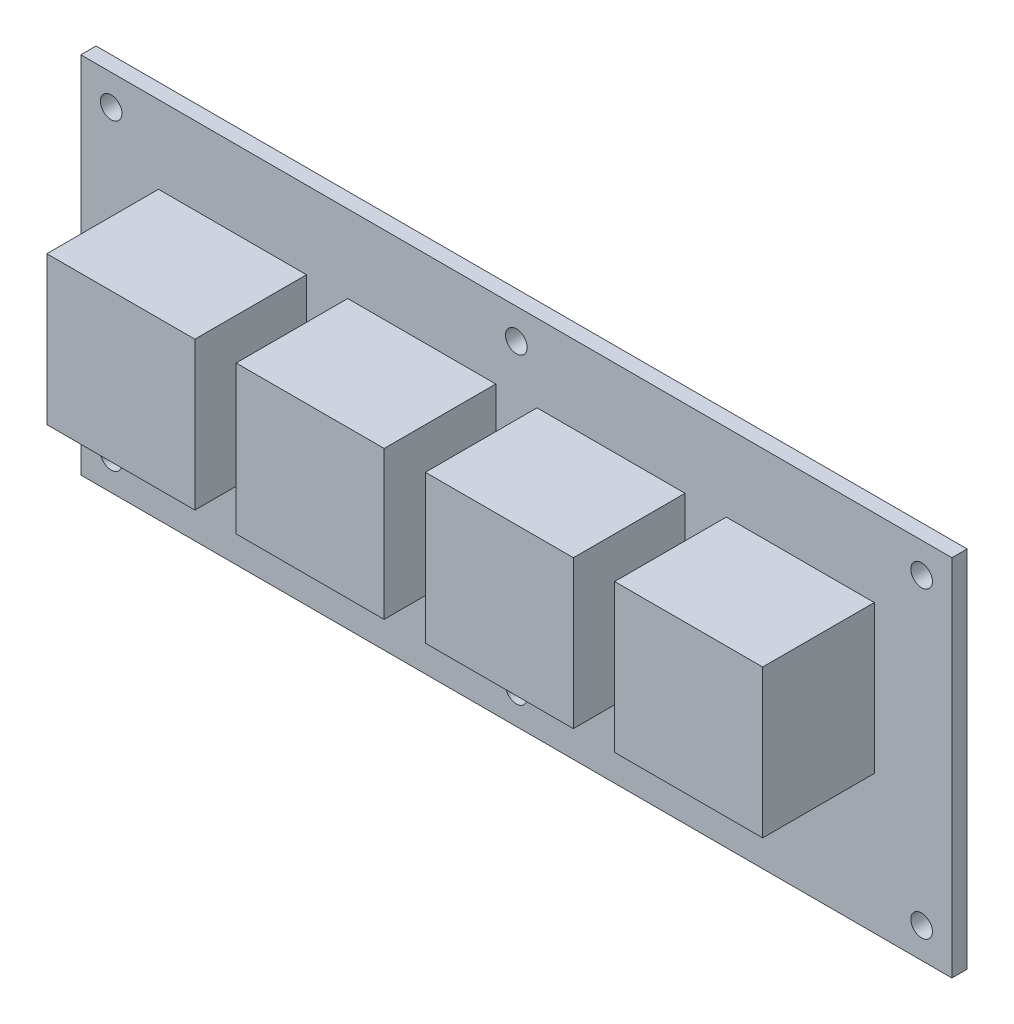
ISO-10303-21;
HEADER;
FILE_DESCRIPTION(('STEP AP214'),'2;1');
FILE_NAME('part.step','',(''),(''),'','','');
FILE_SCHEMA(('AUTOMOTIVE_DESIGN { 1 0 10303 214 1 1 1 1 }'));
ENDSEC;
DATA;
#1=APPLICATION_CONTEXT('core data for automotive mechanical design processes');
#2=APPLICATION_PROTOCOL_DEFINITION('international standard','automotive_design',2000,#1);
#3=PRODUCT_CONTEXT('',#1,'mechanical');
#4=PRODUCT('Part','Part','',(#3));
#5=PRODUCT_RELATED_PRODUCT_CATEGORY('part','',(#4));
#6=PRODUCT_DEFINITION_FORMATION('','',#4);
#7=PRODUCT_DEFINITION_CONTEXT('part definition',#1,'design');
#8=PRODUCT_DEFINITION('design','',#6,#7);
#9=PRODUCT_DEFINITION_SHAPE('','',#8);
#10=(LENGTH_UNIT() NAMED_UNIT(*) SI_UNIT(.MILLI.,.METRE.));
#11=(NAMED_UNIT(*) PLANE_ANGLE_UNIT() SI_UNIT($,.RADIAN.));
#12=(NAMED_UNIT(*) SI_UNIT($,.STERADIAN.) SOLID_ANGLE_UNIT());
#13=UNCERTAINTY_MEASURE_WITH_UNIT(LENGTH_MEASURE(1.E-05),#10,'distance_accuracy_value','');
#14=(GEOMETRIC_REPRESENTATION_CONTEXT(3) GLOBAL_UNCERTAINTY_ASSIGNED_CONTEXT((#13)) GLOBAL_UNIT_ASSIGNED_CONTEXT((#10,
#11,#12)) REPRESENTATION_CONTEXT('',''));
#15=CARTESIAN_POINT('',(0.,0.,0.));
#16=DIRECTION('',(0.,0.,1.));
#17=DIRECTION('',(1.,0.,0.));
#18=AXIS2_PLACEMENT_3D('',#15,#16,#17);
#19=CARTESIAN_POINT('',(23.622,14.478,13.276072));
#20=DIRECTION('',(0.,1.,0.));
#21=DIRECTION('',(0.,0.,1.));
#22=AXIS2_PLACEMENT_3D('',#19,#20,#21);
#23=PLANE('',#22);
#24=DIRECTION('',(1.,0.,0.));
#25=VECTOR('',#24,1.);
#26=CARTESIAN_POINT('',(23.622,14.478,1.592072));
#27=LINE('',#26,#25);
#28=CARTESIAN_POINT('',(8.128,14.478,1.592072));
#29=VERTEX_POINT('',#28);
#30=CARTESIAN_POINT('',(23.622,14.478,1.592072));
#31=VERTEX_POINT('',#30);
#32=EDGE_CURVE('E106',#29,#31,#27,.T.);
#33=ORIENTED_EDGE('',*,*,#32,.T.);
#34=DIRECTION('',(0.,0.,-1.));
#35=VECTOR('',#34,1.);
#36=CARTESIAN_POINT('',(23.622,14.478,13.276072));
#37=LINE('',#36,#35);
#38=CARTESIAN_POINT('',(23.622,14.478,13.276072));
#39=VERTEX_POINT('',#38);
#40=EDGE_CURVE('E12',#39,#31,#37,.T.);
#41=ORIENTED_EDGE('',*,*,#40,.F.);
#42=DIRECTION('',(1.,0.,0.));
#43=VECTOR('',#42,1.);
#44=CARTESIAN_POINT('',(23.622,14.478,13.276072));
#45=LINE('',#44,#43);
#46=CARTESIAN_POINT('',(8.128,14.478,13.276072));
#47=VERTEX_POINT('',#46);
#48=EDGE_CURVE('E94',#47,#39,#45,.T.);
#49=ORIENTED_EDGE('',*,*,#48,.F.);
#50=DIRECTION('',(0.,0.,-1.));
#51=VECTOR('',#50,1.);
#52=CARTESIAN_POINT('',(8.128,14.478,13.276072));
#53=LINE('',#52,#51);
#54=EDGE_CURVE('E102',#47,#29,#53,.T.);
#55=ORIENTED_EDGE('',*,*,#54,.T.);
#56=EDGE_LOOP('',(#33,#41,#49,#55));
#57=FACE_BOUND('',#56,.T.);
#58=ADVANCED_FACE('F43',(#57),#23,.F.);
#59=CARTESIAN_POINT('',(23.622,29.972,13.276072));
#60=DIRECTION('',(-1.,0.,0.));
#61=DIRECTION('',(0.,0.,1.));
#62=AXIS2_PLACEMENT_3D('',#59,#60,#61);
#63=PLANE('',#62);
#64=DIRECTION('',(0.,1.,0.));
#65=VECTOR('',#64,1.);
#66=CARTESIAN_POINT('',(23.622,29.972,1.592072));
#67=LINE('',#66,#65);
#68=CARTESIAN_POINT('',(23.622,29.972,1.592072));
#69=VERTEX_POINT('',#68);
#70=EDGE_CURVE('E98',#31,#69,#67,.T.);
#71=ORIENTED_EDGE('',*,*,#70,.T.);
#72=DIRECTION('',(0.,0.,-1.));
#73=VECTOR('',#72,1.);
#74=CARTESIAN_POINT('',(23.622,29.972,13.276072));
#75=LINE('',#74,#73);
#76=CARTESIAN_POINT('',(23.622,29.972,13.276072));
#77=VERTEX_POINT('',#76);
#78=EDGE_CURVE('E51',#77,#69,#75,.T.);
#79=ORIENTED_EDGE('',*,*,#78,.F.);
#80=DIRECTION('',(0.,1.,0.));
#81=VECTOR('',#80,1.);
#82=CARTESIAN_POINT('',(23.622,29.972,13.276072));
#83=LINE('',#82,#81);
#84=EDGE_CURVE('E89',#39,#77,#83,.T.);
#85=ORIENTED_EDGE('',*,*,#84,.F.);
#86=ORIENTED_EDGE('',*,*,#40,.T.);
#87=EDGE_LOOP('',(#71,#79,#85,#86));
#88=FACE_BOUND('',#87,.T.);
#89=ADVANCED_FACE('F97',(#88),#63,.F.);
#90=CARTESIAN_POINT('',(8.128,29.972,13.276072));
#91=DIRECTION('',(0.,-1.,0.));
#92=DIRECTION('',(0.,0.,-1.));
#93=AXIS2_PLACEMENT_3D('',#90,#91,#92);
#94=PLANE('',#93);
#95=DIRECTION('',(-1.,0.,0.));
#96=VECTOR('',#95,1.);
#97=CARTESIAN_POINT('',(8.128,29.972,1.592072));
#98=LINE('',#97,#96);
#99=CARTESIAN_POINT('',(8.128,29.972,1.592072));
#100=VERTEX_POINT('',#99);
#101=EDGE_CURVE('E76',#69,#100,#98,.T.);
#102=ORIENTED_EDGE('',*,*,#101,.T.);
#103=DIRECTION('',(0.,0.,-1.));
#104=VECTOR('',#103,1.);
#105=CARTESIAN_POINT('',(8.128,29.972,13.276072));
#106=LINE('',#105,#104);
#107=CARTESIAN_POINT('',(8.128,29.972,13.276072));
#108=VERTEX_POINT('',#107);
#109=EDGE_CURVE('E99',#108,#100,#106,.T.);
#110=ORIENTED_EDGE('',*,*,#109,.F.);
#111=DIRECTION('',(-1.,0.,0.));
#112=VECTOR('',#111,1.);
#113=CARTESIAN_POINT('',(8.128,29.972,13.276072));
#114=LINE('',#113,#112);
#115=EDGE_CURVE('E92',#77,#108,#114,.T.);
#116=ORIENTED_EDGE('',*,*,#115,.F.);
#117=ORIENTED_EDGE('',*,*,#78,.T.);
#118=EDGE_LOOP('',(#102,#110,#116,#117));
#119=FACE_BOUND('',#118,.T.);
#120=ADVANCED_FACE('F100',(#119),#94,.F.);
#121=CARTESIAN_POINT('',(8.128,14.478,13.276072));
#122=DIRECTION('',(1.,0.,0.));
#123=DIRECTION('',(0.,0.,-1.));
#124=AXIS2_PLACEMENT_3D('',#121,#122,#123);
#125=PLANE('',#124);
#126=DIRECTION('',(0.,-1.,0.));
#127=VECTOR('',#126,1.);
#128=CARTESIAN_POINT('',(8.128,14.478,1.592072));
#129=LINE('',#128,#127);
#130=EDGE_CURVE('E82',#100,#29,#129,.T.);
#131=ORIENTED_EDGE('',*,*,#130,.T.);
#132=ORIENTED_EDGE('',*,*,#54,.F.);
#133=DIRECTION('',(0.,-1.,0.));
#134=VECTOR('',#133,1.);
#135=CARTESIAN_POINT('',(8.128,14.478,13.276072));
#136=LINE('',#135,#134);
#137=EDGE_CURVE('E59',#108,#47,#136,.T.);
#138=ORIENTED_EDGE('',*,*,#137,.F.);
#139=ORIENTED_EDGE('',*,*,#109,.T.);
#140=EDGE_LOOP('',(#131,#132,#138,#139));
#141=FACE_BOUND('',#140,.T.);
#142=ADVANCED_FACE('F113',(#141),#125,.F.);
#143=CARTESIAN_POINT('',(8.128,14.478,13.276072));
#144=DIRECTION('',(0.,0.,-1.));
#145=DIRECTION('',(-1.,0.,0.));
#146=AXIS2_PLACEMENT_3D('',#143,#144,#145);
#147=PLANE('',#146);
#148=ORIENTED_EDGE('',*,*,#48,.T.);
#149=ORIENTED_EDGE('',*,*,#84,.T.);
#150=ORIENTED_EDGE('',*,*,#115,.T.);
#151=ORIENTED_EDGE('',*,*,#137,.T.);
#152=EDGE_LOOP('',(#148,#149,#150,#151));
#153=FACE_BOUND('',#152,.T.);
#154=ADVANCED_FACE('F90',(#153),#147,.F.);
#155=CARTESIAN_POINT('',(8.128,14.478,1.592072));
#156=DIRECTION('',(0.,0.,-1.));
#157=DIRECTION('',(-1.,0.,0.));
#158=AXIS2_PLACEMENT_3D('',#155,#156,#157);
#159=PLANE('',#158);
#160=ORIENTED_EDGE('',*,*,#32,.F.);
#161=ORIENTED_EDGE('',*,*,#130,.F.);
#162=ORIENTED_EDGE('',*,*,#101,.F.);
#163=ORIENTED_EDGE('',*,*,#70,.F.);
#164=EDGE_LOOP('',(#160,#161,#162,#163));
#165=FACE_BOUND('',#164,.T.);
#166=ADVANCED_FACE('F116',(#165),#159,.T.);
#167=CLOSED_SHELL('',(#58,#89,#120,#142,#154,#166));
#168=MANIFOLD_SOLID_BREP('B2',#167);
#169=CARTESIAN_POINT('',(43.434,14.478,13.276072));
#170=DIRECTION('',(0.,1.,0.));
#171=DIRECTION('',(0.,0.,1.));
#172=AXIS2_PLACEMENT_3D('',#169,#170,#171);
#173=PLANE('',#172);
#174=DIRECTION('',(1.,0.,0.));
#175=VECTOR('',#174,1.);
#176=CARTESIAN_POINT('',(43.434,14.478,1.592072));
#177=LINE('',#176,#175);
#178=CARTESIAN_POINT('',(27.94,14.478,1.592072));
#179=VERTEX_POINT('',#178);
#180=CARTESIAN_POINT('',(43.434,14.478,1.592072));
#181=VERTEX_POINT('',#180);
#182=EDGE_CURVE('E239',#179,#181,#177,.T.);
#183=ORIENTED_EDGE('',*,*,#182,.T.);
#184=DIRECTION('',(0.,0.,-1.));
#185=VECTOR('',#184,1.);
#186=CARTESIAN_POINT('',(43.434,14.478,13.276072));
#187=LINE('',#186,#185);
#188=CARTESIAN_POINT('',(43.434,14.478,13.276072));
#189=VERTEX_POINT('',#188);
#190=EDGE_CURVE('E41',#189,#181,#187,.T.);
#191=ORIENTED_EDGE('',*,*,#190,.F.);
#192=DIRECTION('',(1.,0.,0.));
#193=VECTOR('',#192,1.);
#194=CARTESIAN_POINT('',(43.434,14.478,13.276072));
#195=LINE('',#194,#193);
#196=CARTESIAN_POINT('',(27.94,14.478,13.276072));
#197=VERTEX_POINT('',#196);
#198=EDGE_CURVE('E227',#197,#189,#195,.T.);
#199=ORIENTED_EDGE('',*,*,#198,.F.);
#200=DIRECTION('',(0.,0.,-1.));
#201=VECTOR('',#200,1.);
#202=CARTESIAN_POINT('',(27.94,14.478,13.276072));
#203=LINE('',#202,#201);
#204=EDGE_CURVE('E235',#197,#179,#203,.T.);
#205=ORIENTED_EDGE('',*,*,#204,.T.);
#206=EDGE_LOOP('',(#183,#191,#199,#205));
#207=FACE_BOUND('',#206,.T.);
#208=ADVANCED_FACE('F176',(#207),#173,.F.);
#209=CARTESIAN_POINT('',(43.434,29.972,13.276072));
#210=DIRECTION('',(-1.,0.,0.));
#211=DIRECTION('',(0.,0.,1.));
#212=AXIS2_PLACEMENT_3D('',#209,#210,#211);
#213=PLANE('',#212);
#214=DIRECTION('',(0.,1.,0.));
#215=VECTOR('',#214,1.);
#216=CARTESIAN_POINT('',(43.434,29.972,1.592072));
#217=LINE('',#216,#215);
#218=CARTESIAN_POINT('',(43.434,29.972,1.592072));
#219=VERTEX_POINT('',#218);
#220=EDGE_CURVE('E231',#181,#219,#217,.T.);
#221=ORIENTED_EDGE('',*,*,#220,.T.);
#222=DIRECTION('',(0.,0.,-1.));
#223=VECTOR('',#222,1.);
#224=CARTESIAN_POINT('',(43.434,29.972,13.276072));
#225=LINE('',#224,#223);
#226=CARTESIAN_POINT('',(43.434,29.972,13.276072));
#227=VERTEX_POINT('',#226);
#228=EDGE_CURVE('E184',#227,#219,#225,.T.);
#229=ORIENTED_EDGE('',*,*,#228,.F.);
#230=DIRECTION('',(0.,1.,0.));
#231=VECTOR('',#230,1.);
#232=CARTESIAN_POINT('',(43.434,29.972,13.276072));
#233=LINE('',#232,#231);
#234=EDGE_CURVE('E222',#189,#227,#233,.T.);
#235=ORIENTED_EDGE('',*,*,#234,.F.);
#236=ORIENTED_EDGE('',*,*,#190,.T.);
#237=EDGE_LOOP('',(#221,#229,#235,#236));
#238=FACE_BOUND('',#237,.T.);
#239=ADVANCED_FACE('F230',(#238),#213,.F.);
#240=CARTESIAN_POINT('',(27.94,29.972,13.276072));
#241=DIRECTION('',(0.,-1.,0.));
#242=DIRECTION('',(0.,0.,-1.));
#243=AXIS2_PLACEMENT_3D('',#240,#241,#242);
#244=PLANE('',#243);
#245=DIRECTION('',(-1.,0.,0.));
#246=VECTOR('',#245,1.);
#247=CARTESIAN_POINT('',(27.94,29.972,1.592072));
#248=LINE('',#247,#246);
#249=CARTESIAN_POINT('',(27.94,29.972,1.592072));
#250=VERTEX_POINT('',#249);
#251=EDGE_CURVE('E209',#219,#250,#248,.T.);
#252=ORIENTED_EDGE('',*,*,#251,.T.);
#253=DIRECTION('',(0.,0.,-1.));
#254=VECTOR('',#253,1.);
#255=CARTESIAN_POINT('',(27.94,29.972,13.276072));
#256=LINE('',#255,#254);
#257=CARTESIAN_POINT('',(27.94,29.972,13.276072));
#258=VERTEX_POINT('',#257);
#259=EDGE_CURVE('E232',#258,#250,#256,.T.);
#260=ORIENTED_EDGE('',*,*,#259,.F.);
#261=DIRECTION('',(-1.,0.,0.));
#262=VECTOR('',#261,1.);
#263=CARTESIAN_POINT('',(27.94,29.972,13.276072));
#264=LINE('',#263,#262);
#265=EDGE_CURVE('E225',#227,#258,#264,.T.);
#266=ORIENTED_EDGE('',*,*,#265,.F.);
#267=ORIENTED_EDGE('',*,*,#228,.T.);
#268=EDGE_LOOP('',(#252,#260,#266,#267));
#269=FACE_BOUND('',#268,.T.);
#270=ADVANCED_FACE('F233',(#269),#244,.F.);
#271=CARTESIAN_POINT('',(27.94,14.478,13.276072));
#272=DIRECTION('',(1.,0.,0.));
#273=DIRECTION('',(0.,0.,-1.));
#274=AXIS2_PLACEMENT_3D('',#271,#272,#273);
#275=PLANE('',#274);
#276=DIRECTION('',(0.,-1.,0.));
#277=VECTOR('',#276,1.);
#278=CARTESIAN_POINT('',(27.94,14.478,1.592072));
#279=LINE('',#278,#277);
#280=EDGE_CURVE('E215',#250,#179,#279,.T.);
#281=ORIENTED_EDGE('',*,*,#280,.T.);
#282=ORIENTED_EDGE('',*,*,#204,.F.);
#283=DIRECTION('',(0.,-1.,0.));
#284=VECTOR('',#283,1.);
#285=CARTESIAN_POINT('',(27.94,14.478,13.276072));
#286=LINE('',#285,#284);
#287=EDGE_CURVE('E192',#258,#197,#286,.T.);
#288=ORIENTED_EDGE('',*,*,#287,.F.);
#289=ORIENTED_EDGE('',*,*,#259,.T.);
#290=EDGE_LOOP('',(#281,#282,#288,#289));
#291=FACE_BOUND('',#290,.T.);
#292=ADVANCED_FACE('F246',(#291),#275,.F.);
#293=CARTESIAN_POINT('',(27.94,14.478,13.276072));
#294=DIRECTION('',(0.,0.,-1.));
#295=DIRECTION('',(-1.,0.,0.));
#296=AXIS2_PLACEMENT_3D('',#293,#294,#295);
#297=PLANE('',#296);
#298=ORIENTED_EDGE('',*,*,#198,.T.);
#299=ORIENTED_EDGE('',*,*,#234,.T.);
#300=ORIENTED_EDGE('',*,*,#265,.T.);
#301=ORIENTED_EDGE('',*,*,#287,.T.);
#302=EDGE_LOOP('',(#298,#299,#300,#301));
#303=FACE_BOUND('',#302,.T.);
#304=ADVANCED_FACE('F223',(#303),#297,.F.);
#305=CARTESIAN_POINT('',(27.94,14.478,1.592072));
#306=DIRECTION('',(0.,0.,-1.));
#307=DIRECTION('',(-1.,0.,0.));
#308=AXIS2_PLACEMENT_3D('',#305,#306,#307);
#309=PLANE('',#308);
#310=ORIENTED_EDGE('',*,*,#182,.F.);
#311=ORIENTED_EDGE('',*,*,#280,.F.);
#312=ORIENTED_EDGE('',*,*,#251,.F.);
#313=ORIENTED_EDGE('',*,*,#220,.F.);
#314=EDGE_LOOP('',(#310,#311,#312,#313));
#315=FACE_BOUND('',#314,.T.);
#316=ADVANCED_FACE('F249',(#315),#309,.T.);
#317=CLOSED_SHELL('',(#208,#239,#270,#292,#304,#316));
#318=MANIFOLD_SOLID_BREP('B6',#317);
#319=CARTESIAN_POINT('',(63.246,14.478,13.276072));
#320=DIRECTION('',(0.,1.,0.));
#321=DIRECTION('',(0.,0.,1.));
#322=AXIS2_PLACEMENT_3D('',#319,#320,#321);
#323=PLANE('',#322);
#324=DIRECTION('',(1.,0.,0.));
#325=VECTOR('',#324,1.);
#326=CARTESIAN_POINT('',(63.246,14.478,1.592072));
#327=LINE('',#326,#325);
#328=CARTESIAN_POINT('',(47.752,14.478,1.592072));
#329=VERTEX_POINT('',#328);
#330=CARTESIAN_POINT('',(63.246,14.478,1.592072));
#331=VERTEX_POINT('',#330);
#332=EDGE_CURVE('E372',#329,#331,#327,.T.);
#333=ORIENTED_EDGE('',*,*,#332,.T.);
#334=DIRECTION('',(0.,0.,-1.));
#335=VECTOR('',#334,1.);
#336=CARTESIAN_POINT('',(63.246,14.478,13.276072));
#337=LINE('',#336,#335);
#338=CARTESIAN_POINT('',(63.246,14.478,13.276072));
#339=VERTEX_POINT('',#338);
#340=EDGE_CURVE('E174',#339,#331,#337,.T.);
#341=ORIENTED_EDGE('',*,*,#340,.F.);
#342=DIRECTION('',(1.,0.,0.));
#343=VECTOR('',#342,1.);
#344=CARTESIAN_POINT('',(63.246,14.478,13.276072));
#345=LINE('',#344,#343);
#346=CARTESIAN_POINT('',(47.752,14.478,13.276072));
#347=VERTEX_POINT('',#346);
#348=EDGE_CURVE('E360',#347,#339,#345,.T.);
#349=ORIENTED_EDGE('',*,*,#348,.F.);
#350=DIRECTION('',(0.,0.,-1.));
#351=VECTOR('',#350,1.);
#352=CARTESIAN_POINT('',(47.752,14.478,13.276072));
#353=LINE('',#352,#351);
#354=EDGE_CURVE('E368',#347,#329,#353,.T.);
#355=ORIENTED_EDGE('',*,*,#354,.T.);
#356=EDGE_LOOP('',(#333,#341,#349,#355));
#357=FACE_BOUND('',#356,.T.);
#358=ADVANCED_FACE('F309',(#357),#323,.F.);
#359=CARTESIAN_POINT('',(63.246,29.972,13.276072));
#360=DIRECTION('',(-1.,0.,0.));
#361=DIRECTION('',(0.,0.,1.));
#362=AXIS2_PLACEMENT_3D('',#359,#360,#361);
#363=PLANE('',#362);
#364=DIRECTION('',(0.,1.,0.));
#365=VECTOR('',#364,1.);
#366=CARTESIAN_POINT('',(63.246,29.972,1.592072));
#367=LINE('',#366,#365);
#368=CARTESIAN_POINT('',(63.246,29.972,1.592072));
#369=VERTEX_POINT('',#368);
#370=EDGE_CURVE('E364',#331,#369,#367,.T.);
#371=ORIENTED_EDGE('',*,*,#370,.T.);
#372=DIRECTION('',(0.,0.,-1.));
#373=VECTOR('',#372,1.);
#374=CARTESIAN_POINT('',(63.246,29.972,13.276072));
#375=LINE('',#374,#373);
#376=CARTESIAN_POINT('',(63.246,29.972,13.276072));
#377=VERTEX_POINT('',#376);
#378=EDGE_CURVE('E317',#377,#369,#375,.T.);
#379=ORIENTED_EDGE('',*,*,#378,.F.);
#380=DIRECTION('',(0.,1.,0.));
#381=VECTOR('',#380,1.);
#382=CARTESIAN_POINT('',(63.246,29.972,13.276072));
#383=LINE('',#382,#381);
#384=EDGE_CURVE('E355',#339,#377,#383,.T.);
#385=ORIENTED_EDGE('',*,*,#384,.F.);
#386=ORIENTED_EDGE('',*,*,#340,.T.);
#387=EDGE_LOOP('',(#371,#379,#385,#386));
#388=FACE_BOUND('',#387,.T.);
#389=ADVANCED_FACE('F363',(#388),#363,.F.);
#390=CARTESIAN_POINT('',(47.752,29.972,13.276072));
#391=DIRECTION('',(0.,-1.,0.));
#392=DIRECTION('',(0.,0.,-1.));
#393=AXIS2_PLACEMENT_3D('',#390,#391,#392);
#394=PLANE('',#393);
#395=DIRECTION('',(-1.,0.,0.));
#396=VECTOR('',#395,1.);
#397=CARTESIAN_POINT('',(47.752,29.972,1.592072));
#398=LINE('',#397,#396);
#399=CARTESIAN_POINT('',(47.752,29.972,1.592072));
#400=VERTEX_POINT('',#399);
#401=EDGE_CURVE('E342',#369,#400,#398,.T.);
#402=ORIENTED_EDGE('',*,*,#401,.T.);
#403=DIRECTION('',(0.,0.,-1.));
#404=VECTOR('',#403,1.);
#405=CARTESIAN_POINT('',(47.752,29.972,13.276072));
#406=LINE('',#405,#404);
#407=CARTESIAN_POINT('',(47.752,29.972,13.276072));
#408=VERTEX_POINT('',#407);
#409=EDGE_CURVE('E365',#408,#400,#406,.T.);
#410=ORIENTED_EDGE('',*,*,#409,.F.);
#411=DIRECTION('',(-1.,0.,0.));
#412=VECTOR('',#411,1.);
#413=CARTESIAN_POINT('',(47.752,29.972,13.276072));
#414=LINE('',#413,#412);
#415=EDGE_CURVE('E358',#377,#408,#414,.T.);
#416=ORIENTED_EDGE('',*,*,#415,.F.);
#417=ORIENTED_EDGE('',*,*,#378,.T.);
#418=EDGE_LOOP('',(#402,#410,#416,#417));
#419=FACE_BOUND('',#418,.T.);
#420=ADVANCED_FACE('F366',(#419),#394,.F.);
#421=CARTESIAN_POINT('',(47.752,14.478,13.276072));
#422=DIRECTION('',(1.,0.,0.));
#423=DIRECTION('',(0.,0.,-1.));
#424=AXIS2_PLACEMENT_3D('',#421,#422,#423);
#425=PLANE('',#424);
#426=DIRECTION('',(0.,-1.,0.));
#427=VECTOR('',#426,1.);
#428=CARTESIAN_POINT('',(47.752,14.478,1.592072));
#429=LINE('',#428,#427);
#430=EDGE_CURVE('E348',#400,#329,#429,.T.);
#431=ORIENTED_EDGE('',*,*,#430,.T.);
#432=ORIENTED_EDGE('',*,*,#354,.F.);
#433=DIRECTION('',(0.,-1.,0.));
#434=VECTOR('',#433,1.);
#435=CARTESIAN_POINT('',(47.752,14.478,13.276072));
#436=LINE('',#435,#434);
#437=EDGE_CURVE('E325',#408,#347,#436,.T.);
#438=ORIENTED_EDGE('',*,*,#437,.F.);
#439=ORIENTED_EDGE('',*,*,#409,.T.);
#440=EDGE_LOOP('',(#431,#432,#438,#439));
#441=FACE_BOUND('',#440,.T.);
#442=ADVANCED_FACE('F379',(#441),#425,.F.);
#443=CARTESIAN_POINT('',(47.752,14.478,13.276072));
#444=DIRECTION('',(0.,0.,-1.));
#445=DIRECTION('',(-1.,0.,0.));
#446=AXIS2_PLACEMENT_3D('',#443,#444,#445);
#447=PLANE('',#446);
#448=ORIENTED_EDGE('',*,*,#348,.T.);
#449=ORIENTED_EDGE('',*,*,#384,.T.);
#450=ORIENTED_EDGE('',*,*,#415,.T.);
#451=ORIENTED_EDGE('',*,*,#437,.T.);
#452=EDGE_LOOP('',(#448,#449,#450,#451));
#453=FACE_BOUND('',#452,.T.);
#454=ADVANCED_FACE('F356',(#453),#447,.F.);
#455=CARTESIAN_POINT('',(47.752,14.478,1.592072));
#456=DIRECTION('',(0.,0.,-1.));
#457=DIRECTION('',(-1.,0.,0.));
#458=AXIS2_PLACEMENT_3D('',#455,#456,#457);
#459=PLANE('',#458);
#460=ORIENTED_EDGE('',*,*,#332,.F.);
#461=ORIENTED_EDGE('',*,*,#430,.F.);
#462=ORIENTED_EDGE('',*,*,#401,.F.);
#463=ORIENTED_EDGE('',*,*,#370,.F.);
#464=EDGE_LOOP('',(#460,#461,#462,#463));
#465=FACE_BOUND('',#464,.T.);
#466=ADVANCED_FACE('F382',(#465),#459,.T.);
#467=CLOSED_SHELL('',(#358,#389,#420,#442,#454,#466));
#468=MANIFOLD_SOLID_BREP('B35',#467);
#469=CARTESIAN_POINT('',(83.058,14.478,13.276072));
#470=DIRECTION('',(0.,1.,0.));
#471=DIRECTION('',(0.,0.,1.));
#472=AXIS2_PLACEMENT_3D('',#469,#470,#471);
#473=PLANE('',#472);
#474=DIRECTION('',(1.,0.,0.));
#475=VECTOR('',#474,1.);
#476=CARTESIAN_POINT('',(83.058,14.478,1.592072));
#477=LINE('',#476,#475);
#478=CARTESIAN_POINT('',(67.564,14.478,1.592072));
#479=VERTEX_POINT('',#478);
#480=CARTESIAN_POINT('',(83.058,14.478,1.592072));
#481=VERTEX_POINT('',#480);
#482=EDGE_CURVE('E504',#479,#481,#477,.T.);
#483=ORIENTED_EDGE('',*,*,#482,.T.);
#484=DIRECTION('',(0.,0.,-1.));
#485=VECTOR('',#484,1.);
#486=CARTESIAN_POINT('',(83.058,14.478,13.276072));
#487=LINE('',#486,#485);
#488=CARTESIAN_POINT('',(83.058,14.478,13.276072));
#489=VERTEX_POINT('',#488);
#490=EDGE_CURVE('E307',#489,#481,#487,.T.);
#491=ORIENTED_EDGE('',*,*,#490,.F.);
#492=DIRECTION('',(1.,0.,0.));
#493=VECTOR('',#492,1.);
#494=CARTESIAN_POINT('',(83.058,14.478,13.276072));
#495=LINE('',#494,#493);
#496=CARTESIAN_POINT('',(67.564,14.478,13.276072));
#497=VERTEX_POINT('',#496);
#498=EDGE_CURVE('E492',#497,#489,#495,.T.);
#499=ORIENTED_EDGE('',*,*,#498,.F.);
#500=DIRECTION('',(0.,0.,-1.));
#501=VECTOR('',#500,1.);
#502=CARTESIAN_POINT('',(67.564,14.478,13.276072));
#503=LINE('',#502,#501);
#504=EDGE_CURVE('E500',#497,#479,#503,.T.);
#505=ORIENTED_EDGE('',*,*,#504,.T.);
#506=EDGE_LOOP('',(#483,#491,#499,#505));
#507=FACE_BOUND('',#506,.T.);
#508=ADVANCED_FACE('F441',(#507),#473,.F.);
#509=CARTESIAN_POINT('',(83.058,29.972,13.276072));
#510=DIRECTION('',(-1.,0.,0.));
#511=DIRECTION('',(0.,0.,1.));
#512=AXIS2_PLACEMENT_3D('',#509,#510,#511);
#513=PLANE('',#512);
#514=DIRECTION('',(0.,1.,0.));
#515=VECTOR('',#514,1.);
#516=CARTESIAN_POINT('',(83.058,29.972,1.592072));
#517=LINE('',#516,#515);
#518=CARTESIAN_POINT('',(83.058,29.972,1.592072));
#519=VERTEX_POINT('',#518);
#520=EDGE_CURVE('E496',#481,#519,#517,.T.);
#521=ORIENTED_EDGE('',*,*,#520,.T.);
#522=DIRECTION('',(0.,0.,-1.));
#523=VECTOR('',#522,1.);
#524=CARTESIAN_POINT('',(83.058,29.972,13.276072));
#525=LINE('',#524,#523);
#526=CARTESIAN_POINT('',(83.058,29.972,13.276072));
#527=VERTEX_POINT('',#526);
#528=EDGE_CURVE('E449',#527,#519,#525,.T.);
#529=ORIENTED_EDGE('',*,*,#528,.F.);
#530=DIRECTION('',(0.,1.,0.));
#531=VECTOR('',#530,1.);
#532=CARTESIAN_POINT('',(83.058,29.972,13.276072));
#533=LINE('',#532,#531);
#534=EDGE_CURVE('E487',#489,#527,#533,.T.);
#535=ORIENTED_EDGE('',*,*,#534,.F.);
#536=ORIENTED_EDGE('',*,*,#490,.T.);
#537=EDGE_LOOP('',(#521,#529,#535,#536));
#538=FACE_BOUND('',#537,.T.);
#539=ADVANCED_FACE('F495',(#538),#513,.F.);
#540=CARTESIAN_POINT('',(67.564,29.972,13.276072));
#541=DIRECTION('',(0.,-1.,0.));
#542=DIRECTION('',(0.,0.,-1.));
#543=AXIS2_PLACEMENT_3D('',#540,#541,#542);
#544=PLANE('',#543);
#545=DIRECTION('',(-1.,0.,0.));
#546=VECTOR('',#545,1.);
#547=CARTESIAN_POINT('',(67.564,29.972,1.592072));
#548=LINE('',#547,#546);
#549=CARTESIAN_POINT('',(67.564,29.972,1.592072));
#550=VERTEX_POINT('',#549);
#551=EDGE_CURVE('E474',#519,#550,#548,.T.);
#552=ORIENTED_EDGE('',*,*,#551,.T.);
#553=DIRECTION('',(0.,0.,-1.));
#554=VECTOR('',#553,1.);
#555=CARTESIAN_POINT('',(67.564,29.972,13.276072));
#556=LINE('',#555,#554);
#557=CARTESIAN_POINT('',(67.564,29.972,13.276072));
#558=VERTEX_POINT('',#557);
#559=EDGE_CURVE('E497',#558,#550,#556,.T.);
#560=ORIENTED_EDGE('',*,*,#559,.F.);
#561=DIRECTION('',(-1.,0.,0.));
#562=VECTOR('',#561,1.);
#563=CARTESIAN_POINT('',(67.564,29.972,13.276072));
#564=LINE('',#563,#562);
#565=EDGE_CURVE('E490',#527,#558,#564,.T.);
#566=ORIENTED_EDGE('',*,*,#565,.F.);
#567=ORIENTED_EDGE('',*,*,#528,.T.);
#568=EDGE_LOOP('',(#552,#560,#566,#567));
#569=FACE_BOUND('',#568,.T.);
#570=ADVANCED_FACE('F498',(#569),#544,.F.);
#571=CARTESIAN_POINT('',(67.564,14.478,13.276072));
#572=DIRECTION('',(1.,0.,0.));
#573=DIRECTION('',(0.,0.,-1.));
#574=AXIS2_PLACEMENT_3D('',#571,#572,#573);
#575=PLANE('',#574);
#576=DIRECTION('',(0.,-1.,0.));
#577=VECTOR('',#576,1.);
#578=CARTESIAN_POINT('',(67.564,14.478,1.592072));
#579=LINE('',#578,#577);
#580=EDGE_CURVE('E480',#550,#479,#579,.T.);
#581=ORIENTED_EDGE('',*,*,#580,.T.);
#582=ORIENTED_EDGE('',*,*,#504,.F.);
#583=DIRECTION('',(0.,-1.,0.));
#584=VECTOR('',#583,1.);
#585=CARTESIAN_POINT('',(67.564,14.478,13.276072));
#586=LINE('',#585,#584);
#587=EDGE_CURVE('E457',#558,#497,#586,.T.);
#588=ORIENTED_EDGE('',*,*,#587,.F.);
#589=ORIENTED_EDGE('',*,*,#559,.T.);
#590=EDGE_LOOP('',(#581,#582,#588,#589));
#591=FACE_BOUND('',#590,.T.);
#592=ADVANCED_FACE('F511',(#591),#575,.F.);
#593=CARTESIAN_POINT('',(67.564,14.478,13.276072));
#594=DIRECTION('',(0.,0.,-1.));
#595=DIRECTION('',(-1.,0.,0.));
#596=AXIS2_PLACEMENT_3D('',#593,#594,#595);
#597=PLANE('',#596);
#598=ORIENTED_EDGE('',*,*,#498,.T.);
#599=ORIENTED_EDGE('',*,*,#534,.T.);
#600=ORIENTED_EDGE('',*,*,#565,.T.);
#601=ORIENTED_EDGE('',*,*,#587,.T.);
#602=EDGE_LOOP('',(#598,#599,#600,#601));
#603=FACE_BOUND('',#602,.T.);
#604=ADVANCED_FACE('F488',(#603),#597,.F.);
#605=CARTESIAN_POINT('',(67.564,14.478,1.592072));
#606=DIRECTION('',(0.,0.,-1.));
#607=DIRECTION('',(-1.,0.,0.));
#608=AXIS2_PLACEMENT_3D('',#605,#606,#607);
#609=PLANE('',#608);
#610=ORIENTED_EDGE('',*,*,#482,.F.);
#611=ORIENTED_EDGE('',*,*,#580,.F.);
#612=ORIENTED_EDGE('',*,*,#551,.F.);
#613=ORIENTED_EDGE('',*,*,#520,.F.);
#614=EDGE_LOOP('',(#610,#611,#612,#613));
#615=FACE_BOUND('',#614,.T.);
#616=ADVANCED_FACE('F514',(#615),#609,.T.);
#617=CLOSED_SHELL('',(#508,#539,#570,#592,#604,#616));
#618=MANIFOLD_SOLID_BREP('B168',#617);
#619=CARTESIAN_POINT('',(0.,38.1,1.592072));
#620=DIRECTION('',(1.,0.,0.));
#621=DIRECTION('',(0.,0.,-1.));
#622=AXIS2_PLACEMENT_3D('',#619,#620,#621);
#623=PLANE('',#622);
#624=DIRECTION('',(0.,-1.,0.));
#625=VECTOR('',#624,1.);
#626=CARTESIAN_POINT('',(0.,38.1,0.));
#627=LINE('',#626,#625);
#628=CARTESIAN_POINT('',(0.,38.1,0.));
#629=VERTEX_POINT('',#628);
#630=CARTESIAN_POINT('',(0.,0.,0.));
#631=VERTEX_POINT('',#630);
#632=EDGE_CURVE('E630',#629,#631,#627,.T.);
#633=ORIENTED_EDGE('',*,*,#632,.T.);
#634=DIRECTION('',(0.,0.,-1.));
#635=VECTOR('',#634,1.);
#636=CARTESIAN_POINT('',(0.,0.,1.592072));
#637=LINE('',#636,#635);
#638=CARTESIAN_POINT('',(0.,0.,1.592072));
#639=VERTEX_POINT('',#638);
#640=EDGE_CURVE('E439',#639,#631,#637,.T.);
#641=ORIENTED_EDGE('',*,*,#640,.F.);
#642=DIRECTION('',(0.,-1.,0.));
#643=VECTOR('',#642,1.);
#644=CARTESIAN_POINT('',(0.,38.1,1.592072));
#645=LINE('',#644,#643);
#646=CARTESIAN_POINT('',(0.,38.1,1.592072));
#647=VERTEX_POINT('',#646);
#648=EDGE_CURVE('E617',#647,#639,#645,.T.);
#649=ORIENTED_EDGE('',*,*,#648,.F.);
#650=DIRECTION('',(0.,0.,-1.));
#651=VECTOR('',#650,1.);
#652=CARTESIAN_POINT('',(0.,38.1,1.592072));
#653=LINE('',#652,#651);
#654=EDGE_CURVE('E626',#647,#629,#653,.T.);
#655=ORIENTED_EDGE('',*,*,#654,.T.);
#656=EDGE_LOOP('',(#633,#641,#649,#655));
#657=FACE_BOUND('',#656,.T.);
#658=ADVANCED_FACE('F564',(#657),#623,.F.);
#659=CARTESIAN_POINT('',(0.,0.,1.592072));
#660=DIRECTION('',(0.,1.,0.));
#661=DIRECTION('',(0.,0.,1.));
#662=AXIS2_PLACEMENT_3D('',#659,#660,#661);
#663=PLANE('',#662);
#664=DIRECTION('',(1.,0.,0.));
#665=VECTOR('',#664,1.);
#666=CARTESIAN_POINT('',(0.,0.,0.));
#667=LINE('',#666,#665);
#668=CARTESIAN_POINT('',(91.186,0.,0.));
#669=VERTEX_POINT('',#668);
#670=EDGE_CURVE('E621',#631,#669,#667,.T.);
#671=ORIENTED_EDGE('',*,*,#670,.T.);
#672=DIRECTION('',(0.,0.,-1.));
#673=VECTOR('',#672,1.);
#674=CARTESIAN_POINT('',(91.186,0.,1.592072));
#675=LINE('',#674,#673);
#676=CARTESIAN_POINT('',(91.186,0.,1.592072));
#677=VERTEX_POINT('',#676);
#678=EDGE_CURVE('E573',#677,#669,#675,.T.);
#679=ORIENTED_EDGE('',*,*,#678,.F.);
#680=DIRECTION('',(1.,0.,0.));
#681=VECTOR('',#680,1.);
#682=CARTESIAN_POINT('',(0.,0.,1.592072));
#683=LINE('',#682,#681);
#684=EDGE_CURVE('E612',#639,#677,#683,.T.);
#685=ORIENTED_EDGE('',*,*,#684,.F.);
#686=ORIENTED_EDGE('',*,*,#640,.T.);
#687=EDGE_LOOP('',(#671,#679,#685,#686));
#688=FACE_BOUND('',#687,.T.);
#689=ADVANCED_FACE('F620',(#688),#663,.F.);
#690=CARTESIAN_POINT('',(91.186,0.,1.592072));
#691=DIRECTION('',(-1.,0.,0.));
#692=DIRECTION('',(0.,0.,1.));
#693=AXIS2_PLACEMENT_3D('',#690,#691,#692);
#694=PLANE('',#693);
#695=DIRECTION('',(0.,1.,0.));
#696=VECTOR('',#695,1.);
#697=CARTESIAN_POINT('',(91.186,0.,0.));
#698=LINE('',#697,#696);
#699=CARTESIAN_POINT('',(91.186,38.1,0.));
#700=VERTEX_POINT('',#699);
#701=EDGE_CURVE('E599',#669,#700,#698,.T.);
#702=ORIENTED_EDGE('',*,*,#701,.T.);
#703=DIRECTION('',(0.,0.,-1.));
#704=VECTOR('',#703,1.);
#705=CARTESIAN_POINT('',(91.186,38.1,1.592072));
#706=LINE('',#705,#704);
#707=CARTESIAN_POINT('',(91.186,38.1,1.592072));
#708=VERTEX_POINT('',#707);
#709=EDGE_CURVE('E622',#708,#700,#706,.T.);
#710=ORIENTED_EDGE('',*,*,#709,.F.);
#711=DIRECTION('',(0.,1.,0.));
#712=VECTOR('',#711,1.);
#713=CARTESIAN_POINT('',(91.186,0.,1.592072));
#714=LINE('',#713,#712);
#715=EDGE_CURVE('E615',#677,#708,#714,.T.);
#716=ORIENTED_EDGE('',*,*,#715,.F.);
#717=ORIENTED_EDGE('',*,*,#678,.T.);
#718=EDGE_LOOP('',(#702,#710,#716,#717));
#719=FACE_BOUND('',#718,.T.);
#720=ADVANCED_FACE('F624',(#719),#694,.F.);
#721=CARTESIAN_POINT('',(91.186,38.1,1.592072));
#722=DIRECTION('',(0.,-1.,0.));
#723=DIRECTION('',(0.,0.,-1.));
#724=AXIS2_PLACEMENT_3D('',#721,#722,#723);
#725=PLANE('',#724);
#726=DIRECTION('',(-1.,0.,0.));
#727=VECTOR('',#726,1.);
#728=CARTESIAN_POINT('',(91.186,38.1,0.));
#729=LINE('',#728,#727);
#730=EDGE_CURVE('E605',#700,#629,#729,.T.);
#731=ORIENTED_EDGE('',*,*,#730,.T.);
#732=ORIENTED_EDGE('',*,*,#654,.F.);
#733=DIRECTION('',(-1.,0.,0.));
#734=VECTOR('',#733,1.);
#735=CARTESIAN_POINT('',(91.186,38.1,1.592072));
#736=LINE('',#735,#734);
#737=EDGE_CURVE('E582',#708,#647,#736,.T.);
#738=ORIENTED_EDGE('',*,*,#737,.F.);
#739=ORIENTED_EDGE('',*,*,#709,.T.);
#740=EDGE_LOOP('',(#731,#732,#738,#739));
#741=FACE_BOUND('',#740,.T.);
#742=ADVANCED_FACE('F680',(#741),#725,.F.);
#743=CARTESIAN_POINT('',(0.,0.,1.592072));
#744=DIRECTION('',(0.,0.,1.));
#745=DIRECTION('',(1.,0.,0.));
#746=AXIS2_PLACEMENT_3D('',#743,#744,#745);
#747=PLANE('',#746);
#748=CARTESIAN_POINT('',(3.175,3.175,1.592072));
#749=DIRECTION('',(0.,0.,1.));
#750=DIRECTION('',(1.,0.,0.));
#751=AXIS2_PLACEMENT_3D('',#748,#749,#750);
#752=CIRCLE('',#751,1.1303);
#753=CARTESIAN_POINT('',(4.3053,3.175,1.592072));
#754=VERTEX_POINT('',#753);
#755=EDGE_CURVE('E665',#754,#754,#752,.T.);
#756=ORIENTED_EDGE('',*,*,#755,.F.);
#757=EDGE_LOOP('',(#756));
#758=FACE_BOUND('',#757,.T.);
#759=CARTESIAN_POINT('',(3.175,34.925,1.592072));
#760=DIRECTION('',(0.,0.,1.));
#761=DIRECTION('',(1.,0.,0.));
#762=AXIS2_PLACEMENT_3D('',#759,#760,#761);
#763=CIRCLE('',#762,1.1303);
#764=CARTESIAN_POINT('',(4.3053,34.925,1.592072));
#765=VERTEX_POINT('',#764);
#766=EDGE_CURVE('E655',#765,#765,#763,.T.);
#767=ORIENTED_EDGE('',*,*,#766,.F.);
#768=EDGE_LOOP('',(#767));
#769=FACE_BOUND('',#768,.T.);
#770=CARTESIAN_POINT('',(45.593,3.175,1.592072));
#771=DIRECTION('',(0.,0.,1.));
#772=DIRECTION('',(1.,0.,0.));
#773=AXIS2_PLACEMENT_3D('',#770,#771,#772);
#774=CIRCLE('',#773,1.1303);
#775=CARTESIAN_POINT('',(46.7233,3.175,1.592072));
#776=VERTEX_POINT('',#775);
#777=EDGE_CURVE('E652',#776,#776,#774,.T.);
#778=ORIENTED_EDGE('',*,*,#777,.F.);
#779=EDGE_LOOP('',(#778));
#780=FACE_BOUND('',#779,.T.);
#781=CARTESIAN_POINT('',(45.593,34.925,1.592072));
#782=DIRECTION('',(0.,0.,1.));
#783=DIRECTION('',(1.,0.,0.));
#784=AXIS2_PLACEMENT_3D('',#781,#782,#783);
#785=CIRCLE('',#784,1.1303);
#786=CARTESIAN_POINT('',(46.7233,34.925,1.592072));
#787=VERTEX_POINT('',#786);
#788=EDGE_CURVE('E649',#787,#787,#785,.T.);
#789=ORIENTED_EDGE('',*,*,#788,.F.);
#790=EDGE_LOOP('',(#789));
#791=FACE_BOUND('',#790,.T.);
#792=CARTESIAN_POINT('',(88.011,3.175,1.592072));
#793=DIRECTION('',(0.,0.,1.));
#794=DIRECTION('',(1.,0.,0.));
#795=AXIS2_PLACEMENT_3D('',#792,#793,#794);
#796=CIRCLE('',#795,1.1303);
#797=CARTESIAN_POINT('',(89.1413,3.175,1.592072));
#798=VERTEX_POINT('',#797);
#799=EDGE_CURVE('E645',#798,#798,#796,.T.);
#800=ORIENTED_EDGE('',*,*,#799,.F.);
#801=EDGE_LOOP('',(#800));
#802=FACE_BOUND('',#801,.T.);
#803=CARTESIAN_POINT('',(88.011,34.925,1.592072));
#804=DIRECTION('',(0.,0.,1.));
#805=DIRECTION('',(1.,0.,0.));
#806=AXIS2_PLACEMENT_3D('',#803,#804,#805);
#807=CIRCLE('',#806,1.1303);
#808=CARTESIAN_POINT('',(89.1413,34.925,1.592072));
#809=VERTEX_POINT('',#808);
#810=EDGE_CURVE('E641',#809,#809,#807,.T.);
#811=ORIENTED_EDGE('',*,*,#810,.F.);
#812=EDGE_LOOP('',(#811));
#813=FACE_BOUND('',#812,.T.);
#814=ORIENTED_EDGE('',*,*,#648,.T.);
#815=ORIENTED_EDGE('',*,*,#684,.T.);
#816=ORIENTED_EDGE('',*,*,#715,.T.);
#817=ORIENTED_EDGE('',*,*,#737,.T.);
#818=EDGE_LOOP('',(#814,#815,#816,#817));
#819=FACE_BOUND('',#818,.T.);
#820=ADVANCED_FACE('F613',(#758,#769,#780,#791,#802,#813,#819),#747,.T.);
#821=CARTESIAN_POINT('',(0.,0.,0.));
#822=DIRECTION('',(0.,0.,1.));
#823=DIRECTION('',(1.,0.,0.));
#824=AXIS2_PLACEMENT_3D('',#821,#822,#823);
#825=PLANE('',#824);
#826=CARTESIAN_POINT('',(3.175,3.175,0.));
#827=DIRECTION('',(0.,0.,1.));
#828=DIRECTION('',(1.,0.,0.));
#829=AXIS2_PLACEMENT_3D('',#826,#827,#828);
#830=CIRCLE('',#829,1.1303);
#831=CARTESIAN_POINT('',(4.3053,3.175,0.));
#832=VERTEX_POINT('',#831);
#833=EDGE_CURVE('E567',#832,#832,#830,.T.);
#834=ORIENTED_EDGE('',*,*,#833,.T.);
#835=EDGE_LOOP('',(#834));
#836=FACE_BOUND('',#835,.T.);
#837=CARTESIAN_POINT('',(3.175,34.925,0.));
#838=DIRECTION('',(0.,0.,1.));
#839=DIRECTION('',(1.,0.,0.));
#840=AXIS2_PLACEMENT_3D('',#837,#838,#839);
#841=CIRCLE('',#840,1.1303);
#842=CARTESIAN_POINT('',(4.3053,34.925,0.));
#843=VERTEX_POINT('',#842);
#844=EDGE_CURVE('E653',#843,#843,#841,.T.);
#845=ORIENTED_EDGE('',*,*,#844,.T.);
#846=EDGE_LOOP('',(#845));
#847=FACE_BOUND('',#846,.T.);
#848=CARTESIAN_POINT('',(45.593,3.175,0.));
#849=DIRECTION('',(0.,0.,1.));
#850=DIRECTION('',(1.,0.,0.));
#851=AXIS2_PLACEMENT_3D('',#848,#849,#850);
#852=CIRCLE('',#851,1.1303);
#853=CARTESIAN_POINT('',(46.7233,3.175,0.));
#854=VERTEX_POINT('',#853);
#855=EDGE_CURVE('E650',#854,#854,#852,.T.);
#856=ORIENTED_EDGE('',*,*,#855,.T.);
#857=EDGE_LOOP('',(#856));
#858=FACE_BOUND('',#857,.T.);
#859=CARTESIAN_POINT('',(45.593,34.925,0.));
#860=DIRECTION('',(0.,0.,1.));
#861=DIRECTION('',(1.,0.,0.));
#862=AXIS2_PLACEMENT_3D('',#859,#860,#861);
#863=CIRCLE('',#862,1.1303);
#864=CARTESIAN_POINT('',(46.7233,34.925,0.));
#865=VERTEX_POINT('',#864);
#866=EDGE_CURVE('E646',#865,#865,#863,.T.);
#867=ORIENTED_EDGE('',*,*,#866,.T.);
#868=EDGE_LOOP('',(#867));
#869=FACE_BOUND('',#868,.T.);
#870=CARTESIAN_POINT('',(88.011,3.175,0.));
#871=DIRECTION('',(0.,0.,1.));
#872=DIRECTION('',(1.,0.,0.));
#873=AXIS2_PLACEMENT_3D('',#870,#871,#872);
#874=CIRCLE('',#873,1.1303);
#875=CARTESIAN_POINT('',(89.1413,3.175,0.));
#876=VERTEX_POINT('',#875);
#877=EDGE_CURVE('E642',#876,#876,#874,.T.);
#878=ORIENTED_EDGE('',*,*,#877,.T.);
#879=EDGE_LOOP('',(#878));
#880=FACE_BOUND('',#879,.T.);
#881=CARTESIAN_POINT('',(88.011,34.925,0.));
#882=DIRECTION('',(0.,0.,1.));
#883=DIRECTION('',(1.,0.,0.));
#884=AXIS2_PLACEMENT_3D('',#881,#882,#883);
#885=CIRCLE('',#884,1.1303);
#886=CARTESIAN_POINT('',(89.1413,34.925,0.));
#887=VERTEX_POINT('',#886);
#888=EDGE_CURVE('E633',#887,#887,#885,.T.);
#889=ORIENTED_EDGE('',*,*,#888,.T.);
#890=EDGE_LOOP('',(#889));
#891=FACE_BOUND('',#890,.T.);
#892=ORIENTED_EDGE('',*,*,#632,.F.);
#893=ORIENTED_EDGE('',*,*,#730,.F.);
#894=ORIENTED_EDGE('',*,*,#701,.F.);
#895=ORIENTED_EDGE('',*,*,#670,.F.);
#896=EDGE_LOOP('',(#892,#893,#894,#895));
#897=FACE_BOUND('',#896,.T.);
#898=ADVANCED_FACE('F679',(#836,#847,#858,#869,#880,#891,#897),#825,.F.);
#899=CARTESIAN_POINT('',(88.011,34.925,-8.407928));
#900=DIRECTION('',(0.,0.,1.));
#901=DIRECTION('',(1.,0.,0.));
#902=AXIS2_PLACEMENT_3D('',#899,#900,#901);
#903=CYLINDRICAL_SURFACE('',#902,1.1303);
#904=ORIENTED_EDGE('',*,*,#810,.T.);
#905=EDGE_LOOP('',(#904));
#906=FACE_BOUND('',#905,.T.);
#907=ORIENTED_EDGE('',*,*,#888,.F.);
#908=EDGE_LOOP('',(#907));
#909=FACE_BOUND('',#908,.T.);
#910=ADVANCED_FACE('F675',(#906,#909),#903,.F.);
#911=CARTESIAN_POINT('',(88.011,3.175,-8.407928));
#912=DIRECTION('',(0.,0.,1.));
#913=DIRECTION('',(1.,0.,0.));
#914=AXIS2_PLACEMENT_3D('',#911,#912,#913);
#915=CYLINDRICAL_SURFACE('',#914,1.1303);
#916=ORIENTED_EDGE('',*,*,#799,.T.);
#917=EDGE_LOOP('',(#916));
#918=FACE_BOUND('',#917,.T.);
#919=ORIENTED_EDGE('',*,*,#877,.F.);
#920=EDGE_LOOP('',(#919));
#921=FACE_BOUND('',#920,.T.);
#922=ADVANCED_FACE('F729',(#918,#921),#915,.F.);
#923=CARTESIAN_POINT('',(45.593,34.925,-8.407928));
#924=DIRECTION('',(0.,0.,1.));
#925=DIRECTION('',(1.,0.,0.));
#926=AXIS2_PLACEMENT_3D('',#923,#924,#925);
#927=CYLINDRICAL_SURFACE('',#926,1.1303);
#928=ORIENTED_EDGE('',*,*,#788,.T.);
#929=EDGE_LOOP('',(#928));
#930=FACE_BOUND('',#929,.T.);
#931=ORIENTED_EDGE('',*,*,#866,.F.);
#932=EDGE_LOOP('',(#931));
#933=FACE_BOUND('',#932,.T.);
#934=ADVANCED_FACE('F737',(#930,#933),#927,.F.);
#935=CARTESIAN_POINT('',(45.593,3.175,-8.407928));
#936=DIRECTION('',(0.,0.,1.));
#937=DIRECTION('',(1.,0.,0.));
#938=AXIS2_PLACEMENT_3D('',#935,#936,#937);
#939=CYLINDRICAL_SURFACE('',#938,1.1303);
#940=ORIENTED_EDGE('',*,*,#777,.T.);
#941=EDGE_LOOP('',(#940));
#942=FACE_BOUND('',#941,.T.);
#943=ORIENTED_EDGE('',*,*,#855,.F.);
#944=EDGE_LOOP('',(#943));
#945=FACE_BOUND('',#944,.T.);
#946=ADVANCED_FACE('F747',(#942,#945),#939,.F.);
#947=CARTESIAN_POINT('',(3.175,34.925,-8.407928));
#948=DIRECTION('',(0.,0.,1.));
#949=DIRECTION('',(1.,0.,0.));
#950=AXIS2_PLACEMENT_3D('',#947,#948,#949);
#951=CYLINDRICAL_SURFACE('',#950,1.1303);
#952=ORIENTED_EDGE('',*,*,#766,.T.);
#953=EDGE_LOOP('',(#952));
#954=FACE_BOUND('',#953,.T.);
#955=ORIENTED_EDGE('',*,*,#844,.F.);
#956=EDGE_LOOP('',(#955));
#957=FACE_BOUND('',#956,.T.);
#958=ADVANCED_FACE('F757',(#954,#957),#951,.F.);
#959=CARTESIAN_POINT('',(3.175,3.175,-8.407928));
#960=DIRECTION('',(0.,0.,1.));
#961=DIRECTION('',(1.,0.,0.));
#962=AXIS2_PLACEMENT_3D('',#959,#960,#961);
#963=CYLINDRICAL_SURFACE('',#962,1.1303);
#964=ORIENTED_EDGE('',*,*,#755,.T.);
#965=EDGE_LOOP('',(#964));
#966=FACE_BOUND('',#965,.T.);
#967=ORIENTED_EDGE('',*,*,#833,.F.);
#968=EDGE_LOOP('',(#967));
#969=FACE_BOUND('',#968,.T.);
#970=ADVANCED_FACE('F767',(#966,#969),#963,.F.);
#971=CLOSED_SHELL('',(#658,#689,#720,#742,#820,#898,#910,#922,#934,#946,#958,#970));
#972=MANIFOLD_SOLID_BREP('B301',#971);
#973=ADVANCED_BREP_SHAPE_REPRESENTATION('',(#18,#168,#318,#468,#618,#972),#14);
#974=SHAPE_DEFINITION_REPRESENTATION(#9,#973);
ENDSEC;
END-ISO-10303-21;
